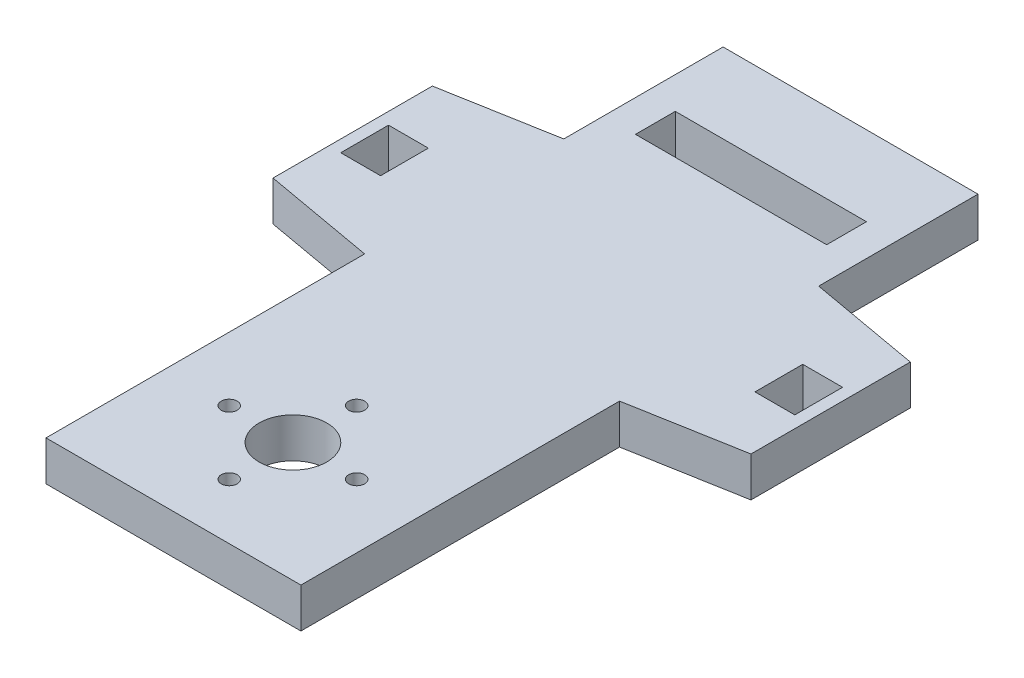
ISO-10303-21;
HEADER;
FILE_DESCRIPTION(('STEP AP214'),'2;1');
FILE_NAME('part.step','',(''),(''),'','','');
FILE_SCHEMA(('AUTOMOTIVE_DESIGN { 1 0 10303 214 1 1 1 1 }'));
ENDSEC;
DATA;
#1=APPLICATION_CONTEXT('core data for automotive mechanical design processes');
#2=APPLICATION_PROTOCOL_DEFINITION('international standard','automotive_design',2000,#1);
#3=PRODUCT_CONTEXT('',#1,'mechanical');
#4=PRODUCT('Part','Part','',(#3));
#5=PRODUCT_RELATED_PRODUCT_CATEGORY('part','',(#4));
#6=PRODUCT_DEFINITION_FORMATION('','',#4);
#7=PRODUCT_DEFINITION_CONTEXT('part definition',#1,'design');
#8=PRODUCT_DEFINITION('design','',#6,#7);
#9=PRODUCT_DEFINITION_SHAPE('','',#8);
#10=(LENGTH_UNIT() NAMED_UNIT(*) SI_UNIT(.MILLI.,.METRE.));
#11=(NAMED_UNIT(*) PLANE_ANGLE_UNIT() SI_UNIT($,.RADIAN.));
#12=(NAMED_UNIT(*) SI_UNIT($,.STERADIAN.) SOLID_ANGLE_UNIT());
#13=UNCERTAINTY_MEASURE_WITH_UNIT(LENGTH_MEASURE(1.E-05),#10,'distance_accuracy_value','');
#14=(GEOMETRIC_REPRESENTATION_CONTEXT(3) GLOBAL_UNCERTAINTY_ASSIGNED_CONTEXT((#13)) GLOBAL_UNIT_ASSIGNED_CONTEXT((#10,
#11,#12)) REPRESENTATION_CONTEXT('',''));
#15=CARTESIAN_POINT('',(0.,0.,0.));
#16=DIRECTION('',(0.,0.,1.));
#17=DIRECTION('',(1.,0.,0.));
#18=AXIS2_PLACEMENT_3D('',#15,#16,#17);
#19=CARTESIAN_POINT('',(-16.,5.,2.5));
#20=DIRECTION('',(1.,0.,0.));
#21=DIRECTION('',(0.,0.,-1.));
#22=AXIS2_PLACEMENT_3D('',#19,#20,#21);
#23=PLANE('',#22);
#24=DIRECTION('',(0.,0.,1.));
#25=VECTOR('',#24,1.);
#26=CARTESIAN_POINT('',(-16.,0.,2.5));
#27=LINE('',#26,#25);
#28=CARTESIAN_POINT('',(-16.,0.,2.5));
#29=VERTEX_POINT('',#28);
#30=CARTESIAN_POINT('',(-16.,0.,42.5));
#31=VERTEX_POINT('',#30);
#32=EDGE_CURVE('E325',#29,#31,#27,.T.);
#33=ORIENTED_EDGE('',*,*,#32,.T.);
#34=DIRECTION('',(0.,-1.,0.));
#35=VECTOR('',#34,1.);
#36=CARTESIAN_POINT('',(-16.,5.,42.5));
#37=LINE('',#36,#35);
#38=CARTESIAN_POINT('',(-16.,5.,42.5));
#39=VERTEX_POINT('',#38);
#40=EDGE_CURVE('E11',#39,#31,#37,.T.);
#41=ORIENTED_EDGE('',*,*,#40,.F.);
#42=DIRECTION('',(0.,0.,1.));
#43=VECTOR('',#42,1.);
#44=CARTESIAN_POINT('',(-16.,5.,2.5));
#45=LINE('',#44,#43);
#46=CARTESIAN_POINT('',(-16.,5.,2.5));
#47=VERTEX_POINT('',#46);
#48=EDGE_CURVE('E328',#47,#39,#45,.T.);
#49=ORIENTED_EDGE('',*,*,#48,.F.);
#50=DIRECTION('',(0.,-1.,0.));
#51=VECTOR('',#50,1.);
#52=CARTESIAN_POINT('',(-16.,5.,2.5));
#53=LINE('',#52,#51);
#54=EDGE_CURVE('E354',#47,#29,#53,.T.);
#55=ORIENTED_EDGE('',*,*,#54,.T.);
#56=EDGE_LOOP('',(#33,#41,#49,#55));
#57=FACE_BOUND('',#56,.T.);
#58=ADVANCED_FACE('F36',(#57),#23,.F.);
#59=CARTESIAN_POINT('',(-16.,5.,42.5));
#60=DIRECTION('',(0.,0.,-1.));
#61=DIRECTION('',(-1.,0.,0.));
#62=AXIS2_PLACEMENT_3D('',#59,#60,#61);
#63=PLANE('',#62);
#64=DIRECTION('',(1.,0.,0.));
#65=VECTOR('',#64,1.);
#66=CARTESIAN_POINT('',(-16.,0.,42.5));
#67=LINE('',#66,#65);
#68=CARTESIAN_POINT('',(16.,0.,42.5));
#69=VERTEX_POINT('',#68);
#70=EDGE_CURVE('E357',#31,#69,#67,.T.);
#71=ORIENTED_EDGE('',*,*,#70,.T.);
#72=DIRECTION('',(0.,-1.,0.));
#73=VECTOR('',#72,1.);
#74=CARTESIAN_POINT('',(16.,5.,42.5));
#75=LINE('',#74,#73);
#76=CARTESIAN_POINT('',(16.,5.,42.5));
#77=VERTEX_POINT('',#76);
#78=EDGE_CURVE('E43',#77,#69,#75,.T.);
#79=ORIENTED_EDGE('',*,*,#78,.F.);
#80=DIRECTION('',(1.,0.,0.));
#81=VECTOR('',#80,1.);
#82=CARTESIAN_POINT('',(-16.,5.,42.5));
#83=LINE('',#82,#81);
#84=EDGE_CURVE('E331',#39,#77,#83,.T.);
#85=ORIENTED_EDGE('',*,*,#84,.F.);
#86=ORIENTED_EDGE('',*,*,#40,.T.);
#87=EDGE_LOOP('',(#71,#79,#85,#86));
#88=FACE_BOUND('',#87,.T.);
#89=ADVANCED_FACE('F433',(#88),#63,.F.);
#90=CARTESIAN_POINT('',(16.,5.,42.5));
#91=DIRECTION('',(-1.,0.,0.));
#92=DIRECTION('',(0.,0.,1.));
#93=AXIS2_PLACEMENT_3D('',#90,#91,#92);
#94=PLANE('',#93);
#95=DIRECTION('',(0.,0.,-1.));
#96=VECTOR('',#95,1.);
#97=CARTESIAN_POINT('',(16.,0.,42.5));
#98=LINE('',#97,#96);
#99=CARTESIAN_POINT('',(16.,0.,2.5));
#100=VERTEX_POINT('',#99);
#101=EDGE_CURVE('E359',#69,#100,#98,.T.);
#102=ORIENTED_EDGE('',*,*,#101,.T.);
#103=DIRECTION('',(0.,-1.,0.));
#104=VECTOR('',#103,1.);
#105=CARTESIAN_POINT('',(16.,5.,2.5));
#106=LINE('',#105,#104);
#107=CARTESIAN_POINT('',(16.,5.,2.5));
#108=VERTEX_POINT('',#107);
#109=EDGE_CURVE('E404',#108,#100,#106,.T.);
#110=ORIENTED_EDGE('',*,*,#109,.F.);
#111=DIRECTION('',(0.,0.,-1.));
#112=VECTOR('',#111,1.);
#113=CARTESIAN_POINT('',(16.,5.,42.5));
#114=LINE('',#113,#112);
#115=EDGE_CURVE('E334',#77,#108,#114,.T.);
#116=ORIENTED_EDGE('',*,*,#115,.F.);
#117=ORIENTED_EDGE('',*,*,#78,.T.);
#118=EDGE_LOOP('',(#102,#110,#116,#117));
#119=FACE_BOUND('',#118,.T.);
#120=ADVANCED_FACE('F411',(#119),#94,.F.);
#121=CARTESIAN_POINT('',(16.,5.,2.5));
#122=DIRECTION('',(-0.175790638483658,0.,-0.984427575508482));
#123=DIRECTION('',(-0.984427575508482,0.,0.175790638483658));
#124=AXIS2_PLACEMENT_3D('',#121,#122,#123);
#125=PLANE('',#124);
#126=DIRECTION('',(0.984427575508482,0.,-0.175790638483658));
#127=VECTOR('',#126,1.);
#128=CARTESIAN_POINT('',(16.,0.,2.5));
#129=LINE('',#128,#127);
#130=CARTESIAN_POINT('',(30.,0.,0.));
#131=VERTEX_POINT('',#130);
#132=EDGE_CURVE('E361',#100,#131,#129,.T.);
#133=ORIENTED_EDGE('',*,*,#132,.T.);
#134=DIRECTION('',(0.,-1.,0.));
#135=VECTOR('',#134,1.);
#136=CARTESIAN_POINT('',(30.,5.,0.));
#137=LINE('',#136,#135);
#138=CARTESIAN_POINT('',(30.,5.,0.));
#139=VERTEX_POINT('',#138);
#140=EDGE_CURVE('E401',#139,#131,#137,.T.);
#141=ORIENTED_EDGE('',*,*,#140,.F.);
#142=DIRECTION('',(0.984427575508482,0.,-0.175790638483658));
#143=VECTOR('',#142,1.);
#144=CARTESIAN_POINT('',(16.,5.,2.5));
#145=LINE('',#144,#143);
#146=EDGE_CURVE('E336',#108,#139,#145,.T.);
#147=ORIENTED_EDGE('',*,*,#146,.F.);
#148=ORIENTED_EDGE('',*,*,#109,.T.);
#149=EDGE_LOOP('',(#133,#141,#147,#148));
#150=FACE_BOUND('',#149,.T.);
#151=ADVANCED_FACE('F421',(#150),#125,.F.);
#152=CARTESIAN_POINT('',(30.,5.,0.));
#153=DIRECTION('',(-1.,0.,0.));
#154=DIRECTION('',(0.,0.,1.));
#155=AXIS2_PLACEMENT_3D('',#152,#153,#154);
#156=PLANE('',#155);
#157=DIRECTION('',(0.,0.,-1.));
#158=VECTOR('',#157,1.);
#159=CARTESIAN_POINT('',(30.,0.,0.));
#160=LINE('',#159,#158);
#161=CARTESIAN_POINT('',(30.,0.,-20.));
#162=VERTEX_POINT('',#161);
#163=EDGE_CURVE('E363',#131,#162,#160,.T.);
#164=ORIENTED_EDGE('',*,*,#163,.T.);
#165=DIRECTION('',(0.,-1.,0.));
#166=VECTOR('',#165,1.);
#167=CARTESIAN_POINT('',(30.,5.,-20.));
#168=LINE('',#167,#166);
#169=CARTESIAN_POINT('',(30.,5.,-20.));
#170=VERTEX_POINT('',#169);
#171=EDGE_CURVE('E398',#170,#162,#168,.T.);
#172=ORIENTED_EDGE('',*,*,#171,.F.);
#173=DIRECTION('',(0.,0.,-1.));
#174=VECTOR('',#173,1.);
#175=CARTESIAN_POINT('',(30.,5.,0.));
#176=LINE('',#175,#174);
#177=EDGE_CURVE('E338',#139,#170,#176,.T.);
#178=ORIENTED_EDGE('',*,*,#177,.F.);
#179=ORIENTED_EDGE('',*,*,#140,.T.);
#180=EDGE_LOOP('',(#164,#172,#178,#179));
#181=FACE_BOUND('',#180,.T.);
#182=ADVANCED_FACE('F425',(#181),#156,.F.);
#183=CARTESIAN_POINT('',(30.,5.,-20.));
#184=DIRECTION('',(-0.175790638483657,0.,0.984427575508482));
#185=DIRECTION('',(0.984427575508482,0.,0.175790638483657));
#186=AXIS2_PLACEMENT_3D('',#183,#184,#185);
#187=PLANE('',#186);
#188=DIRECTION('',(-0.984427575508482,0.,-0.175790638483657));
#189=VECTOR('',#188,1.);
#190=CARTESIAN_POINT('',(30.,0.,-20.));
#191=LINE('',#190,#189);
#192=CARTESIAN_POINT('',(16.,0.,-22.5));
#193=VERTEX_POINT('',#192);
#194=EDGE_CURVE('E365',#162,#193,#191,.T.);
#195=ORIENTED_EDGE('',*,*,#194,.T.);
#196=DIRECTION('',(0.,-1.,0.));
#197=VECTOR('',#196,1.);
#198=CARTESIAN_POINT('',(16.,5.,-22.5));
#199=LINE('',#198,#197);
#200=CARTESIAN_POINT('',(16.,5.,-22.5));
#201=VERTEX_POINT('',#200);
#202=EDGE_CURVE('E395',#201,#193,#199,.T.);
#203=ORIENTED_EDGE('',*,*,#202,.F.);
#204=DIRECTION('',(-0.984427575508482,0.,-0.175790638483657));
#205=VECTOR('',#204,1.);
#206=CARTESIAN_POINT('',(30.,5.,-20.));
#207=LINE('',#206,#205);
#208=EDGE_CURVE('E340',#170,#201,#207,.T.);
#209=ORIENTED_EDGE('',*,*,#208,.F.);
#210=ORIENTED_EDGE('',*,*,#171,.T.);
#211=EDGE_LOOP('',(#195,#203,#209,#210));
#212=FACE_BOUND('',#211,.T.);
#213=ADVANCED_FACE('F466',(#212),#187,.F.);
#214=CARTESIAN_POINT('',(16.,5.,-22.5));
#215=DIRECTION('',(-1.,0.,0.));
#216=DIRECTION('',(0.,0.,1.));
#217=AXIS2_PLACEMENT_3D('',#214,#215,#216);
#218=PLANE('',#217);
#219=DIRECTION('',(0.,0.,-1.));
#220=VECTOR('',#219,1.);
#221=CARTESIAN_POINT('',(16.,0.,-22.5));
#222=LINE('',#221,#220);
#223=CARTESIAN_POINT('',(16.,0.,-42.5));
#224=VERTEX_POINT('',#223);
#225=EDGE_CURVE('E367',#193,#224,#222,.T.);
#226=ORIENTED_EDGE('',*,*,#225,.T.);
#227=DIRECTION('',(0.,-1.,0.));
#228=VECTOR('',#227,1.);
#229=CARTESIAN_POINT('',(16.,5.,-42.5));
#230=LINE('',#229,#228);
#231=CARTESIAN_POINT('',(16.,5.,-42.5));
#232=VERTEX_POINT('',#231);
#233=EDGE_CURVE('E392',#232,#224,#230,.T.);
#234=ORIENTED_EDGE('',*,*,#233,.F.);
#235=DIRECTION('',(0.,0.,-1.));
#236=VECTOR('',#235,1.);
#237=CARTESIAN_POINT('',(16.,5.,-22.5));
#238=LINE('',#237,#236);
#239=EDGE_CURVE('E342',#201,#232,#238,.T.);
#240=ORIENTED_EDGE('',*,*,#239,.F.);
#241=ORIENTED_EDGE('',*,*,#202,.T.);
#242=EDGE_LOOP('',(#226,#234,#240,#241));
#243=FACE_BOUND('',#242,.T.);
#244=ADVANCED_FACE('F464',(#243),#218,.F.);
#245=CARTESIAN_POINT('',(16.,5.,-42.5));
#246=DIRECTION('',(0.,0.,1.));
#247=DIRECTION('',(1.,0.,0.));
#248=AXIS2_PLACEMENT_3D('',#245,#246,#247);
#249=PLANE('',#248);
#250=DIRECTION('',(-1.,0.,0.));
#251=VECTOR('',#250,1.);
#252=CARTESIAN_POINT('',(16.,0.,-42.5));
#253=LINE('',#252,#251);
#254=CARTESIAN_POINT('',(-16.,0.,-42.5));
#255=VERTEX_POINT('',#254);
#256=EDGE_CURVE('E369',#224,#255,#253,.T.);
#257=ORIENTED_EDGE('',*,*,#256,.T.);
#258=DIRECTION('',(0.,-1.,0.));
#259=VECTOR('',#258,1.);
#260=CARTESIAN_POINT('',(-16.,5.,-42.5));
#261=LINE('',#260,#259);
#262=CARTESIAN_POINT('',(-16.,5.,-42.5));
#263=VERTEX_POINT('',#262);
#264=EDGE_CURVE('E389',#263,#255,#261,.T.);
#265=ORIENTED_EDGE('',*,*,#264,.F.);
#266=DIRECTION('',(-1.,0.,0.));
#267=VECTOR('',#266,1.);
#268=CARTESIAN_POINT('',(16.,5.,-42.5));
#269=LINE('',#268,#267);
#270=EDGE_CURVE('E344',#232,#263,#269,.T.);
#271=ORIENTED_EDGE('',*,*,#270,.F.);
#272=ORIENTED_EDGE('',*,*,#233,.T.);
#273=EDGE_LOOP('',(#257,#265,#271,#272));
#274=FACE_BOUND('',#273,.T.);
#275=ADVANCED_FACE('F460',(#274),#249,.F.);
#276=CARTESIAN_POINT('',(-16.,5.,-42.5));
#277=DIRECTION('',(1.,0.,0.));
#278=DIRECTION('',(0.,0.,-1.));
#279=AXIS2_PLACEMENT_3D('',#276,#277,#278);
#280=PLANE('',#279);
#281=DIRECTION('',(0.,0.,1.));
#282=VECTOR('',#281,1.);
#283=CARTESIAN_POINT('',(-16.,0.,-42.5));
#284=LINE('',#283,#282);
#285=CARTESIAN_POINT('',(-16.,0.,-22.5));
#286=VERTEX_POINT('',#285);
#287=EDGE_CURVE('E371',#255,#286,#284,.T.);
#288=ORIENTED_EDGE('',*,*,#287,.T.);
#289=DIRECTION('',(0.,-1.,0.));
#290=VECTOR('',#289,1.);
#291=CARTESIAN_POINT('',(-16.,5.,-22.5));
#292=LINE('',#291,#290);
#293=CARTESIAN_POINT('',(-16.,5.,-22.5));
#294=VERTEX_POINT('',#293);
#295=EDGE_CURVE('E386',#294,#286,#292,.T.);
#296=ORIENTED_EDGE('',*,*,#295,.F.);
#297=DIRECTION('',(0.,0.,1.));
#298=VECTOR('',#297,1.);
#299=CARTESIAN_POINT('',(-16.,5.,-42.5));
#300=LINE('',#299,#298);
#301=EDGE_CURVE('E346',#263,#294,#300,.T.);
#302=ORIENTED_EDGE('',*,*,#301,.F.);
#303=ORIENTED_EDGE('',*,*,#264,.T.);
#304=EDGE_LOOP('',(#288,#296,#302,#303));
#305=FACE_BOUND('',#304,.T.);
#306=ADVANCED_FACE('F455',(#305),#280,.F.);
#307=CARTESIAN_POINT('',(-16.,5.,-22.5));
#308=DIRECTION('',(0.175790638483656,0.,0.984427575508482));
#309=DIRECTION('',(0.984427575508482,0.,-0.175790638483656));
#310=AXIS2_PLACEMENT_3D('',#307,#308,#309);
#311=PLANE('',#310);
#312=DIRECTION('',(-0.984427575508482,0.,0.175790638483656));
#313=VECTOR('',#312,1.);
#314=CARTESIAN_POINT('',(-16.,0.,-22.5));
#315=LINE('',#314,#313);
#316=CARTESIAN_POINT('',(-30.,0.,-20.));
#317=VERTEX_POINT('',#316);
#318=EDGE_CURVE('E373',#286,#317,#315,.T.);
#319=ORIENTED_EDGE('',*,*,#318,.T.);
#320=DIRECTION('',(0.,-1.,0.));
#321=VECTOR('',#320,1.);
#322=CARTESIAN_POINT('',(-30.,5.,-20.));
#323=LINE('',#322,#321);
#324=CARTESIAN_POINT('',(-30.,5.,-20.));
#325=VERTEX_POINT('',#324);
#326=EDGE_CURVE('E383',#325,#317,#323,.T.);
#327=ORIENTED_EDGE('',*,*,#326,.F.);
#328=DIRECTION('',(-0.984427575508482,0.,0.175790638483656));
#329=VECTOR('',#328,1.);
#330=CARTESIAN_POINT('',(-16.,5.,-22.5));
#331=LINE('',#330,#329);
#332=EDGE_CURVE('E348',#294,#325,#331,.T.);
#333=ORIENTED_EDGE('',*,*,#332,.F.);
#334=ORIENTED_EDGE('',*,*,#295,.T.);
#335=EDGE_LOOP('',(#319,#327,#333,#334));
#336=FACE_BOUND('',#335,.T.);
#337=ADVANCED_FACE('F449',(#336),#311,.F.);
#338=CARTESIAN_POINT('',(-30.,5.,-20.));
#339=DIRECTION('',(1.,0.,0.));
#340=DIRECTION('',(0.,0.,-1.));
#341=AXIS2_PLACEMENT_3D('',#338,#339,#340);
#342=PLANE('',#341);
#343=DIRECTION('',(0.,0.,1.));
#344=VECTOR('',#343,1.);
#345=CARTESIAN_POINT('',(-30.,0.,-20.));
#346=LINE('',#345,#344);
#347=CARTESIAN_POINT('',(-30.,0.,0.));
#348=VERTEX_POINT('',#347);
#349=EDGE_CURVE('E375',#317,#348,#346,.T.);
#350=ORIENTED_EDGE('',*,*,#349,.T.);
#351=DIRECTION('',(0.,-1.,0.));
#352=VECTOR('',#351,1.);
#353=CARTESIAN_POINT('',(-30.,5.,0.));
#354=LINE('',#353,#352);
#355=CARTESIAN_POINT('',(-30.,5.,0.));
#356=VERTEX_POINT('',#355);
#357=EDGE_CURVE('E380',#356,#348,#354,.T.);
#358=ORIENTED_EDGE('',*,*,#357,.F.);
#359=DIRECTION('',(0.,0.,1.));
#360=VECTOR('',#359,1.);
#361=CARTESIAN_POINT('',(-30.,5.,-20.));
#362=LINE('',#361,#360);
#363=EDGE_CURVE('E350',#325,#356,#362,.T.);
#364=ORIENTED_EDGE('',*,*,#363,.F.);
#365=ORIENTED_EDGE('',*,*,#326,.T.);
#366=EDGE_LOOP('',(#350,#358,#364,#365));
#367=FACE_BOUND('',#366,.T.);
#368=ADVANCED_FACE('F445',(#367),#342,.F.);
#369=CARTESIAN_POINT('',(-30.,5.,0.));
#370=DIRECTION('',(0.175790638483658,0.,-0.984427575508482));
#371=DIRECTION('',(-0.984427575508482,0.,-0.175790638483658));
#372=AXIS2_PLACEMENT_3D('',#369,#370,#371);
#373=PLANE('',#372);
#374=DIRECTION('',(0.984427575508482,0.,0.175790638483658));
#375=VECTOR('',#374,1.);
#376=CARTESIAN_POINT('',(-30.,0.,0.));
#377=LINE('',#376,#375);
#378=EDGE_CURVE('E332',#348,#29,#377,.T.);
#379=ORIENTED_EDGE('',*,*,#378,.T.);
#380=ORIENTED_EDGE('',*,*,#54,.F.);
#381=DIRECTION('',(0.984427575508482,0.,0.175790638483658));
#382=VECTOR('',#381,1.);
#383=CARTESIAN_POINT('',(-30.,5.,0.));
#384=LINE('',#383,#382);
#385=EDGE_CURVE('E352',#356,#47,#384,.T.);
#386=ORIENTED_EDGE('',*,*,#385,.F.);
#387=ORIENTED_EDGE('',*,*,#357,.T.);
#388=EDGE_LOOP('',(#379,#380,#386,#387));
#389=FACE_BOUND('',#388,.T.);
#390=ADVANCED_FACE('F440',(#389),#373,.F.);
#391=CARTESIAN_POINT('',(0.,5.,0.));
#392=DIRECTION('',(0.,1.,0.));
#393=DIRECTION('',(0.,0.,1.));
#394=AXIS2_PLACEMENT_3D('',#391,#392,#393);
#395=PLANE('',#394);
#396=DIRECTION('',(0.,0.,1.));
#397=VECTOR('',#396,1.);
#398=CARTESIAN_POINT('',(-12.,5.,-32.5));
#399=LINE('',#398,#397);
#400=CARTESIAN_POINT('',(-12.,5.,-32.5));
#401=VERTEX_POINT('',#400);
#402=CARTESIAN_POINT('',(-12.,5.,-27.5));
#403=VERTEX_POINT('',#402);
#404=EDGE_CURVE('E50',#401,#403,#399,.T.);
#405=ORIENTED_EDGE('',*,*,#404,.F.);
#406=DIRECTION('',(-1.,0.,0.));
#407=VECTOR('',#406,1.);
#408=CARTESIAN_POINT('',(-12.,5.,-32.5));
#409=LINE('',#408,#407);
#410=CARTESIAN_POINT('',(12.,5.,-32.5));
#411=VERTEX_POINT('',#410);
#412=EDGE_CURVE('E278',#411,#401,#409,.T.);
#413=ORIENTED_EDGE('',*,*,#412,.F.);
#414=DIRECTION('',(0.,0.,-1.));
#415=VECTOR('',#414,1.);
#416=CARTESIAN_POINT('',(12.,5.,-32.5));
#417=LINE('',#416,#415);
#418=CARTESIAN_POINT('',(12.,5.,-27.5));
#419=VERTEX_POINT('',#418);
#420=EDGE_CURVE('E293',#419,#411,#417,.T.);
#421=ORIENTED_EDGE('',*,*,#420,.F.);
#422=DIRECTION('',(1.,0.,0.));
#423=VECTOR('',#422,1.);
#424=CARTESIAN_POINT('',(-12.,5.,-27.5));
#425=LINE('',#424,#423);
#426=EDGE_CURVE('E289',#403,#419,#425,.T.);
#427=ORIENTED_EDGE('',*,*,#426,.F.);
#428=EDGE_LOOP('',(#405,#413,#421,#427));
#429=FACE_BOUND('',#428,.T.);
#430=CARTESIAN_POINT('',(0.,5.,19.5));
#431=DIRECTION('',(0.,1.,0.));
#432=DIRECTION('',(0.,0.,1.));
#433=AXIS2_PLACEMENT_3D('',#430,#431,#432);
#434=CIRCLE('',#433,1.);
#435=CARTESIAN_POINT('',(0.,5.,20.5));
#436=VERTEX_POINT('',#435);
#437=EDGE_CURVE('E308',#436,#436,#434,.T.);
#438=ORIENTED_EDGE('',*,*,#437,.F.);
#439=EDGE_LOOP('',(#438));
#440=FACE_BOUND('',#439,.T.);
#441=CARTESIAN_POINT('',(8.,5.,27.5));
#442=DIRECTION('',(0.,1.,0.));
#443=DIRECTION('',(0.,0.,1.));
#444=AXIS2_PLACEMENT_3D('',#441,#442,#443);
#445=CIRCLE('',#444,1.);
#446=CARTESIAN_POINT('',(8.,5.,28.5));
#447=VERTEX_POINT('',#446);
#448=EDGE_CURVE('E314',#447,#447,#445,.T.);
#449=ORIENTED_EDGE('',*,*,#448,.F.);
#450=EDGE_LOOP('',(#449));
#451=FACE_BOUND('',#450,.T.);
#452=CARTESIAN_POINT('',(0.,5.,35.5));
#453=DIRECTION('',(0.,1.,0.));
#454=DIRECTION('',(0.,0.,1.));
#455=AXIS2_PLACEMENT_3D('',#452,#453,#454);
#456=CIRCLE('',#455,1.);
#457=CARTESIAN_POINT('',(0.,5.,36.5));
#458=VERTEX_POINT('',#457);
#459=EDGE_CURVE('E233',#458,#458,#456,.T.);
#460=ORIENTED_EDGE('',*,*,#459,.F.);
#461=EDGE_LOOP('',(#460));
#462=FACE_BOUND('',#461,.T.);
#463=DIRECTION('',(-1.,0.,0.));
#464=VECTOR('',#463,1.);
#465=CARTESIAN_POINT('',(-28.5,5.,-13.));
#466=LINE('',#465,#464);
#467=CARTESIAN_POINT('',(-23.5,5.,-13.));
#468=VERTEX_POINT('',#467);
#469=CARTESIAN_POINT('',(-28.5,5.,-13.));
#470=VERTEX_POINT('',#469);
#471=EDGE_CURVE('E58',#468,#470,#466,.T.);
#472=ORIENTED_EDGE('',*,*,#471,.F.);
#473=DIRECTION('',(0.,0.,-1.));
#474=VECTOR('',#473,1.);
#475=CARTESIAN_POINT('',(-23.5,5.,-7.));
#476=LINE('',#475,#474);
#477=CARTESIAN_POINT('',(-23.5,5.,-7.));
#478=VERTEX_POINT('',#477);
#479=EDGE_CURVE('E217',#478,#468,#476,.T.);
#480=ORIENTED_EDGE('',*,*,#479,.F.);
#481=DIRECTION('',(1.,0.,0.));
#482=VECTOR('',#481,1.);
#483=CARTESIAN_POINT('',(-28.5,5.,-7.));
#484=LINE('',#483,#482);
#485=CARTESIAN_POINT('',(-28.5,5.,-7.));
#486=VERTEX_POINT('',#485);
#487=EDGE_CURVE('E220',#486,#478,#484,.T.);
#488=ORIENTED_EDGE('',*,*,#487,.F.);
#489=DIRECTION('',(0.,0.,1.));
#490=VECTOR('',#489,1.);
#491=CARTESIAN_POINT('',(-28.5,5.,-13.));
#492=LINE('',#491,#490);
#493=EDGE_CURVE('E226',#470,#486,#492,.T.);
#494=ORIENTED_EDGE('',*,*,#493,.F.);
#495=EDGE_LOOP('',(#472,#480,#488,#494));
#496=FACE_BOUND('',#495,.T.);
#497=DIRECTION('',(0.,0.,1.));
#498=VECTOR('',#497,1.);
#499=CARTESIAN_POINT('',(23.5,5.,-7.));
#500=LINE('',#499,#498);
#501=CARTESIAN_POINT('',(23.5,5.,-13.));
#502=VERTEX_POINT('',#501);
#503=CARTESIAN_POINT('',(23.5,5.,-7.));
#504=VERTEX_POINT('',#503);
#505=EDGE_CURVE('E251',#502,#504,#500,.T.);
#506=ORIENTED_EDGE('',*,*,#505,.F.);
#507=DIRECTION('',(-1.,0.,0.));
#508=VECTOR('',#507,1.);
#509=CARTESIAN_POINT('',(23.5,5.,-13.));
#510=LINE('',#509,#508);
#511=CARTESIAN_POINT('',(28.5,5.,-13.));
#512=VERTEX_POINT('',#511);
#513=EDGE_CURVE('E241',#512,#502,#510,.T.);
#514=ORIENTED_EDGE('',*,*,#513,.F.);
#515=DIRECTION('',(0.,0.,-1.));
#516=VECTOR('',#515,1.);
#517=CARTESIAN_POINT('',(28.5,5.,-13.));
#518=LINE('',#517,#516);
#519=CARTESIAN_POINT('',(28.5,5.,-7.));
#520=VERTEX_POINT('',#519);
#521=EDGE_CURVE('E257',#520,#512,#518,.T.);
#522=ORIENTED_EDGE('',*,*,#521,.F.);
#523=DIRECTION('',(1.,0.,0.));
#524=VECTOR('',#523,1.);
#525=CARTESIAN_POINT('',(28.5,5.,-7.));
#526=LINE('',#525,#524);
#527=EDGE_CURVE('E253',#504,#520,#526,.T.);
#528=ORIENTED_EDGE('',*,*,#527,.F.);
#529=EDGE_LOOP('',(#506,#514,#522,#528));
#530=FACE_BOUND('',#529,.T.);
#531=CARTESIAN_POINT('',(0.,5.,27.5));
#532=DIRECTION('',(0.,1.,0.));
#533=DIRECTION('',(0.,0.,1.));
#534=AXIS2_PLACEMENT_3D('',#531,#532,#533);
#535=CIRCLE('',#534,4.25);
#536=CARTESIAN_POINT('',(0.,5.,31.75));
#537=VERTEX_POINT('',#536);
#538=EDGE_CURVE('E271',#537,#537,#535,.T.);
#539=ORIENTED_EDGE('',*,*,#538,.F.);
#540=EDGE_LOOP('',(#539));
#541=FACE_BOUND('',#540,.T.);
#542=CARTESIAN_POINT('',(-8.,5.,27.5));
#543=DIRECTION('',(0.,1.,0.));
#544=DIRECTION('',(0.,0.,1.));
#545=AXIS2_PLACEMENT_3D('',#542,#543,#544);
#546=CIRCLE('',#545,1.);
#547=CARTESIAN_POINT('',(-8.,5.,28.5));
#548=VERTEX_POINT('',#547);
#549=EDGE_CURVE('E300',#548,#548,#546,.T.);
#550=ORIENTED_EDGE('',*,*,#549,.F.);
#551=EDGE_LOOP('',(#550));
#552=FACE_BOUND('',#551,.T.);
#553=ORIENTED_EDGE('',*,*,#48,.T.);
#554=ORIENTED_EDGE('',*,*,#84,.T.);
#555=ORIENTED_EDGE('',*,*,#115,.T.);
#556=ORIENTED_EDGE('',*,*,#146,.T.);
#557=ORIENTED_EDGE('',*,*,#177,.T.);
#558=ORIENTED_EDGE('',*,*,#208,.T.);
#559=ORIENTED_EDGE('',*,*,#239,.T.);
#560=ORIENTED_EDGE('',*,*,#270,.T.);
#561=ORIENTED_EDGE('',*,*,#301,.T.);
#562=ORIENTED_EDGE('',*,*,#332,.T.);
#563=ORIENTED_EDGE('',*,*,#363,.T.);
#564=ORIENTED_EDGE('',*,*,#385,.T.);
#565=EDGE_LOOP('',(#553,#554,#555,#556,#557,#558,#559,#560,#561,#562,#563,#564));
#566=FACE_BOUND('',#565,.T.);
#567=ADVANCED_FACE('F429',(#429,#440,#451,#462,#496,#530,#541,#552,#566),#395,.T.);
#568=CARTESIAN_POINT('',(0.,0.,0.));
#569=DIRECTION('',(0.,1.,0.));
#570=DIRECTION('',(0.,0.,1.));
#571=AXIS2_PLACEMENT_3D('',#568,#569,#570);
#572=PLANE('',#571);
#573=DIRECTION('',(-1.,0.,0.));
#574=VECTOR('',#573,1.);
#575=CARTESIAN_POINT('',(-12.,0.,-32.5));
#576=LINE('',#575,#574);
#577=CARTESIAN_POINT('',(12.,0.,-32.5));
#578=VERTEX_POINT('',#577);
#579=CARTESIAN_POINT('',(-12.,0.,-32.5));
#580=VERTEX_POINT('',#579);
#581=EDGE_CURVE('E284',#578,#580,#576,.T.);
#582=ORIENTED_EDGE('',*,*,#581,.T.);
#583=DIRECTION('',(0.,0.,1.));
#584=VECTOR('',#583,1.);
#585=CARTESIAN_POINT('',(-12.,0.,-32.5));
#586=LINE('',#585,#584);
#587=CARTESIAN_POINT('',(-12.,0.,-27.5));
#588=VERTEX_POINT('',#587);
#589=EDGE_CURVE('E274',#580,#588,#586,.T.);
#590=ORIENTED_EDGE('',*,*,#589,.T.);
#591=DIRECTION('',(1.,0.,0.));
#592=VECTOR('',#591,1.);
#593=CARTESIAN_POINT('',(-12.,0.,-27.5));
#594=LINE('',#593,#592);
#595=CARTESIAN_POINT('',(12.,0.,-27.5));
#596=VERTEX_POINT('',#595);
#597=EDGE_CURVE('E277',#588,#596,#594,.T.);
#598=ORIENTED_EDGE('',*,*,#597,.T.);
#599=DIRECTION('',(0.,0.,-1.));
#600=VECTOR('',#599,1.);
#601=CARTESIAN_POINT('',(12.,0.,-32.5));
#602=LINE('',#601,#600);
#603=EDGE_CURVE('E281',#596,#578,#602,.T.);
#604=ORIENTED_EDGE('',*,*,#603,.T.);
#605=EDGE_LOOP('',(#582,#590,#598,#604));
#606=FACE_BOUND('',#605,.T.);
#607=CARTESIAN_POINT('',(0.,0.,19.5));
#608=DIRECTION('',(0.,1.,0.));
#609=DIRECTION('',(0.,0.,1.));
#610=AXIS2_PLACEMENT_3D('',#607,#608,#609);
#611=CIRCLE('',#610,1.);
#612=CARTESIAN_POINT('',(0.,0.,20.5));
#613=VERTEX_POINT('',#612);
#614=EDGE_CURVE('E290',#613,#613,#611,.T.);
#615=ORIENTED_EDGE('',*,*,#614,.T.);
#616=EDGE_LOOP('',(#615));
#617=FACE_BOUND('',#616,.T.);
#618=CARTESIAN_POINT('',(8.,0.,27.5));
#619=DIRECTION('',(0.,1.,0.));
#620=DIRECTION('',(0.,0.,1.));
#621=AXIS2_PLACEMENT_3D('',#618,#619,#620);
#622=CIRCLE('',#621,1.);
#623=CARTESIAN_POINT('',(8.,0.,28.5));
#624=VERTEX_POINT('',#623);
#625=EDGE_CURVE('E311',#624,#624,#622,.T.);
#626=ORIENTED_EDGE('',*,*,#625,.T.);
#627=EDGE_LOOP('',(#626));
#628=FACE_BOUND('',#627,.T.);
#629=CARTESIAN_POINT('',(0.,0.,35.5));
#630=DIRECTION('',(0.,1.,0.));
#631=DIRECTION('',(0.,0.,1.));
#632=AXIS2_PLACEMENT_3D('',#629,#630,#631);
#633=CIRCLE('',#632,1.);
#634=CARTESIAN_POINT('',(0.,0.,36.5));
#635=VERTEX_POINT('',#634);
#636=EDGE_CURVE('E317',#635,#635,#633,.T.);
#637=ORIENTED_EDGE('',*,*,#636,.T.);
#638=EDGE_LOOP('',(#637));
#639=FACE_BOUND('',#638,.T.);
#640=DIRECTION('',(0.,0.,-1.));
#641=VECTOR('',#640,1.);
#642=CARTESIAN_POINT('',(-23.5,0.,-7.));
#643=LINE('',#642,#641);
#644=CARTESIAN_POINT('',(-23.5,0.,-7.));
#645=VERTEX_POINT('',#644);
#646=CARTESIAN_POINT('',(-23.5,0.,-13.));
#647=VERTEX_POINT('',#646);
#648=EDGE_CURVE('E204',#645,#647,#643,.T.);
#649=ORIENTED_EDGE('',*,*,#648,.T.);
#650=DIRECTION('',(-1.,0.,0.));
#651=VECTOR('',#650,1.);
#652=CARTESIAN_POINT('',(-28.5,0.,-13.));
#653=LINE('',#652,#651);
#654=CARTESIAN_POINT('',(-28.5,0.,-13.));
#655=VERTEX_POINT('',#654);
#656=EDGE_CURVE('E198',#647,#655,#653,.T.);
#657=ORIENTED_EDGE('',*,*,#656,.T.);
#658=DIRECTION('',(0.,0.,1.));
#659=VECTOR('',#658,1.);
#660=CARTESIAN_POINT('',(-28.5,0.,-13.));
#661=LINE('',#660,#659);
#662=CARTESIAN_POINT('',(-28.5,0.,-7.));
#663=VERTEX_POINT('',#662);
#664=EDGE_CURVE('E208',#655,#663,#661,.T.);
#665=ORIENTED_EDGE('',*,*,#664,.T.);
#666=DIRECTION('',(1.,0.,0.));
#667=VECTOR('',#666,1.);
#668=CARTESIAN_POINT('',(-28.5,0.,-7.));
#669=LINE('',#668,#667);
#670=EDGE_CURVE('E212',#663,#645,#669,.T.);
#671=ORIENTED_EDGE('',*,*,#670,.T.);
#672=EDGE_LOOP('',(#649,#657,#665,#671));
#673=FACE_BOUND('',#672,.T.);
#674=DIRECTION('',(-1.,0.,0.));
#675=VECTOR('',#674,1.);
#676=CARTESIAN_POINT('',(23.5,0.,-13.));
#677=LINE('',#676,#675);
#678=CARTESIAN_POINT('',(28.5,0.,-13.));
#679=VERTEX_POINT('',#678);
#680=CARTESIAN_POINT('',(23.5,0.,-13.));
#681=VERTEX_POINT('',#680);
#682=EDGE_CURVE('E247',#679,#681,#677,.T.);
#683=ORIENTED_EDGE('',*,*,#682,.T.);
#684=DIRECTION('',(0.,0.,1.));
#685=VECTOR('',#684,1.);
#686=CARTESIAN_POINT('',(23.5,0.,-7.));
#687=LINE('',#686,#685);
#688=CARTESIAN_POINT('',(23.5,0.,-7.));
#689=VERTEX_POINT('',#688);
#690=EDGE_CURVE('E237',#681,#689,#687,.T.);
#691=ORIENTED_EDGE('',*,*,#690,.T.);
#692=DIRECTION('',(1.,0.,0.));
#693=VECTOR('',#692,1.);
#694=CARTESIAN_POINT('',(28.5,0.,-7.));
#695=LINE('',#694,#693);
#696=CARTESIAN_POINT('',(28.5,0.,-7.));
#697=VERTEX_POINT('',#696);
#698=EDGE_CURVE('E240',#689,#697,#695,.T.);
#699=ORIENTED_EDGE('',*,*,#698,.T.);
#700=DIRECTION('',(0.,0.,-1.));
#701=VECTOR('',#700,1.);
#702=CARTESIAN_POINT('',(28.5,0.,-13.));
#703=LINE('',#702,#701);
#704=EDGE_CURVE('E244',#697,#679,#703,.T.);
#705=ORIENTED_EDGE('',*,*,#704,.T.);
#706=EDGE_LOOP('',(#683,#691,#699,#705));
#707=FACE_BOUND('',#706,.T.);
#708=CARTESIAN_POINT('',(0.,0.,27.5));
#709=DIRECTION('',(0.,1.,0.));
#710=DIRECTION('',(0.,0.,1.));
#711=AXIS2_PLACEMENT_3D('',#708,#709,#710);
#712=CIRCLE('',#711,4.25);
#713=CARTESIAN_POINT('',(0.,0.,31.75));
#714=VERTEX_POINT('',#713);
#715=EDGE_CURVE('E254',#714,#714,#712,.T.);
#716=ORIENTED_EDGE('',*,*,#715,.T.);
#717=EDGE_LOOP('',(#716));
#718=FACE_BOUND('',#717,.T.);
#719=CARTESIAN_POINT('',(-8.,0.,27.5));
#720=DIRECTION('',(0.,1.,0.));
#721=DIRECTION('',(0.,0.,1.));
#722=AXIS2_PLACEMENT_3D('',#719,#720,#721);
#723=CIRCLE('',#722,1.);
#724=CARTESIAN_POINT('',(-8.,0.,28.5));
#725=VERTEX_POINT('',#724);
#726=EDGE_CURVE('E322',#725,#725,#723,.T.);
#727=ORIENTED_EDGE('',*,*,#726,.T.);
#728=EDGE_LOOP('',(#727));
#729=FACE_BOUND('',#728,.T.);
#730=ORIENTED_EDGE('',*,*,#32,.F.);
#731=ORIENTED_EDGE('',*,*,#378,.F.);
#732=ORIENTED_EDGE('',*,*,#349,.F.);
#733=ORIENTED_EDGE('',*,*,#318,.F.);
#734=ORIENTED_EDGE('',*,*,#287,.F.);
#735=ORIENTED_EDGE('',*,*,#256,.F.);
#736=ORIENTED_EDGE('',*,*,#225,.F.);
#737=ORIENTED_EDGE('',*,*,#194,.F.);
#738=ORIENTED_EDGE('',*,*,#163,.F.);
#739=ORIENTED_EDGE('',*,*,#132,.F.);
#740=ORIENTED_EDGE('',*,*,#101,.F.);
#741=ORIENTED_EDGE('',*,*,#70,.F.);
#742=EDGE_LOOP('',(#730,#731,#732,#733,#734,#735,#736,#737,#738,#739,#740,#741));
#743=FACE_BOUND('',#742,.T.);
#744=ADVANCED_FACE('F214',(#606,#617,#628,#639,#673,#707,#718,#729,#743),#572,.F.);
#745=CARTESIAN_POINT('',(-8.,0.,27.5));
#746=DIRECTION('',(0.,1.,0.));
#747=DIRECTION('',(0.,0.,1.));
#748=AXIS2_PLACEMENT_3D('',#745,#746,#747);
#749=CYLINDRICAL_SURFACE('',#748,1.);
#750=ORIENTED_EDGE('',*,*,#726,.F.);
#751=EDGE_LOOP('',(#750));
#752=FACE_BOUND('',#751,.T.);
#753=ORIENTED_EDGE('',*,*,#549,.T.);
#754=EDGE_LOOP('',(#753));
#755=FACE_BOUND('',#754,.T.);
#756=ADVANCED_FACE('F558',(#752,#755),#749,.F.);
#757=CARTESIAN_POINT('',(0.,0.,27.5));
#758=DIRECTION('',(0.,1.,0.));
#759=DIRECTION('',(0.,0.,1.));
#760=AXIS2_PLACEMENT_3D('',#757,#758,#759);
#761=CYLINDRICAL_SURFACE('',#760,4.25);
#762=ORIENTED_EDGE('',*,*,#715,.F.);
#763=EDGE_LOOP('',(#762));
#764=FACE_BOUND('',#763,.T.);
#765=ORIENTED_EDGE('',*,*,#538,.T.);
#766=EDGE_LOOP('',(#765));
#767=FACE_BOUND('',#766,.T.);
#768=ADVANCED_FACE('F567',(#764,#767),#761,.F.);
#769=CARTESIAN_POINT('',(23.5,0.,-7.));
#770=DIRECTION('',(-1.,0.,0.));
#771=DIRECTION('',(0.,0.,1.));
#772=AXIS2_PLACEMENT_3D('',#769,#770,#771);
#773=PLANE('',#772);
#774=ORIENTED_EDGE('',*,*,#505,.T.);
#775=DIRECTION('',(0.,1.,0.));
#776=VECTOR('',#775,1.);
#777=CARTESIAN_POINT('',(23.5,0.,-7.));
#778=LINE('',#777,#776);
#779=EDGE_CURVE('E250',#689,#504,#778,.T.);
#780=ORIENTED_EDGE('',*,*,#779,.F.);
#781=ORIENTED_EDGE('',*,*,#690,.F.);
#782=DIRECTION('',(0.,1.,0.));
#783=VECTOR('',#782,1.);
#784=CARTESIAN_POINT('',(23.5,0.,-13.));
#785=LINE('',#784,#783);
#786=EDGE_CURVE('E227',#681,#502,#785,.T.);
#787=ORIENTED_EDGE('',*,*,#786,.T.);
#788=EDGE_LOOP('',(#774,#780,#781,#787));
#789=FACE_BOUND('',#788,.T.);
#790=ADVANCED_FACE('F577',(#789),#773,.F.);
#791=CARTESIAN_POINT('',(23.5,0.,-13.));
#792=DIRECTION('',(0.,0.,-1.));
#793=DIRECTION('',(-1.,0.,0.));
#794=AXIS2_PLACEMENT_3D('',#791,#792,#793);
#795=PLANE('',#794);
#796=ORIENTED_EDGE('',*,*,#513,.T.);
#797=ORIENTED_EDGE('',*,*,#786,.F.);
#798=ORIENTED_EDGE('',*,*,#682,.F.);
#799=DIRECTION('',(0.,1.,0.));
#800=VECTOR('',#799,1.);
#801=CARTESIAN_POINT('',(28.5,0.,-13.));
#802=LINE('',#801,#800);
#803=EDGE_CURVE('E263',#679,#512,#802,.T.);
#804=ORIENTED_EDGE('',*,*,#803,.T.);
#805=EDGE_LOOP('',(#796,#797,#798,#804));
#806=FACE_BOUND('',#805,.T.);
#807=ADVANCED_FACE('F587',(#806),#795,.F.);
#808=CARTESIAN_POINT('',(28.5,0.,-13.));
#809=DIRECTION('',(1.,0.,0.));
#810=DIRECTION('',(0.,0.,-1.));
#811=AXIS2_PLACEMENT_3D('',#808,#809,#810);
#812=PLANE('',#811);
#813=ORIENTED_EDGE('',*,*,#521,.T.);
#814=ORIENTED_EDGE('',*,*,#803,.F.);
#815=ORIENTED_EDGE('',*,*,#704,.F.);
#816=DIRECTION('',(0.,1.,0.));
#817=VECTOR('',#816,1.);
#818=CARTESIAN_POINT('',(28.5,0.,-7.));
#819=LINE('',#818,#817);
#820=EDGE_CURVE('E265',#697,#520,#819,.T.);
#821=ORIENTED_EDGE('',*,*,#820,.T.);
#822=EDGE_LOOP('',(#813,#814,#815,#821));
#823=FACE_BOUND('',#822,.T.);
#824=ADVANCED_FACE('F597',(#823),#812,.F.);
#825=CARTESIAN_POINT('',(28.5,0.,-7.));
#826=DIRECTION('',(0.,0.,1.));
#827=DIRECTION('',(1.,0.,0.));
#828=AXIS2_PLACEMENT_3D('',#825,#826,#827);
#829=PLANE('',#828);
#830=ORIENTED_EDGE('',*,*,#527,.T.);
#831=ORIENTED_EDGE('',*,*,#820,.F.);
#832=ORIENTED_EDGE('',*,*,#698,.F.);
#833=ORIENTED_EDGE('',*,*,#779,.T.);
#834=EDGE_LOOP('',(#830,#831,#832,#833));
#835=FACE_BOUND('',#834,.T.);
#836=ADVANCED_FACE('F607',(#835),#829,.F.);
#837=CARTESIAN_POINT('',(-28.5,0.,-13.));
#838=DIRECTION('',(0.,0.,-1.));
#839=DIRECTION('',(-1.,0.,0.));
#840=AXIS2_PLACEMENT_3D('',#837,#838,#839);
#841=PLANE('',#840);
#842=ORIENTED_EDGE('',*,*,#471,.T.);
#843=DIRECTION('',(0.,1.,0.));
#844=VECTOR('',#843,1.);
#845=CARTESIAN_POINT('',(-28.5,0.,-13.));
#846=LINE('',#845,#844);
#847=EDGE_CURVE('E194',#655,#470,#846,.T.);
#848=ORIENTED_EDGE('',*,*,#847,.F.);
#849=ORIENTED_EDGE('',*,*,#656,.F.);
#850=DIRECTION('',(0.,1.,0.));
#851=VECTOR('',#850,1.);
#852=CARTESIAN_POINT('',(-23.5,0.,-13.));
#853=LINE('',#852,#851);
#854=EDGE_CURVE('E231',#647,#468,#853,.T.);
#855=ORIENTED_EDGE('',*,*,#854,.T.);
#856=EDGE_LOOP('',(#842,#848,#849,#855));
#857=FACE_BOUND('',#856,.T.);
#858=ADVANCED_FACE('F196',(#857),#841,.F.);
#859=CARTESIAN_POINT('',(-23.5,0.,-7.));
#860=DIRECTION('',(1.,0.,0.));
#861=DIRECTION('',(0.,0.,-1.));
#862=AXIS2_PLACEMENT_3D('',#859,#860,#861);
#863=PLANE('',#862);
#864=ORIENTED_EDGE('',*,*,#479,.T.);
#865=ORIENTED_EDGE('',*,*,#854,.F.);
#866=ORIENTED_EDGE('',*,*,#648,.F.);
#867=DIRECTION('',(0.,1.,0.));
#868=VECTOR('',#867,1.);
#869=CARTESIAN_POINT('',(-23.5,0.,-7.));
#870=LINE('',#869,#868);
#871=EDGE_CURVE('E234',#645,#478,#870,.T.);
#872=ORIENTED_EDGE('',*,*,#871,.T.);
#873=EDGE_LOOP('',(#864,#865,#866,#872));
#874=FACE_BOUND('',#873,.T.);
#875=ADVANCED_FACE('F626',(#874),#863,.F.);
#876=CARTESIAN_POINT('',(-28.5,0.,-7.));
#877=DIRECTION('',(0.,0.,1.));
#878=DIRECTION('',(1.,0.,0.));
#879=AXIS2_PLACEMENT_3D('',#876,#877,#878);
#880=PLANE('',#879);
#881=ORIENTED_EDGE('',*,*,#487,.T.);
#882=ORIENTED_EDGE('',*,*,#871,.F.);
#883=ORIENTED_EDGE('',*,*,#670,.F.);
#884=DIRECTION('',(0.,1.,0.));
#885=VECTOR('',#884,1.);
#886=CARTESIAN_POINT('',(-28.5,0.,-7.));
#887=LINE('',#886,#885);
#888=EDGE_CURVE('E203',#663,#486,#887,.T.);
#889=ORIENTED_EDGE('',*,*,#888,.T.);
#890=EDGE_LOOP('',(#881,#882,#883,#889));
#891=FACE_BOUND('',#890,.T.);
#892=ADVANCED_FACE('F635',(#891),#880,.F.);
#893=CARTESIAN_POINT('',(-28.5,0.,-13.));
#894=DIRECTION('',(-1.,0.,0.));
#895=DIRECTION('',(0.,0.,1.));
#896=AXIS2_PLACEMENT_3D('',#893,#894,#895);
#897=PLANE('',#896);
#898=ORIENTED_EDGE('',*,*,#493,.T.);
#899=ORIENTED_EDGE('',*,*,#888,.F.);
#900=ORIENTED_EDGE('',*,*,#664,.F.);
#901=ORIENTED_EDGE('',*,*,#847,.T.);
#902=EDGE_LOOP('',(#898,#899,#900,#901));
#903=FACE_BOUND('',#902,.T.);
#904=ADVANCED_FACE('F209',(#903),#897,.F.);
#905=CARTESIAN_POINT('',(0.,0.,35.5));
#906=DIRECTION('',(0.,1.,0.));
#907=DIRECTION('',(0.,0.,1.));
#908=AXIS2_PLACEMENT_3D('',#905,#906,#907);
#909=CYLINDRICAL_SURFACE('',#908,1.);
#910=ORIENTED_EDGE('',*,*,#636,.F.);
#911=EDGE_LOOP('',(#910));
#912=FACE_BOUND('',#911,.T.);
#913=ORIENTED_EDGE('',*,*,#459,.T.);
#914=EDGE_LOOP('',(#913));
#915=FACE_BOUND('',#914,.T.);
#916=ADVANCED_FACE('F654',(#912,#915),#909,.F.);
#917=CARTESIAN_POINT('',(8.,0.,27.5));
#918=DIRECTION('',(0.,1.,0.));
#919=DIRECTION('',(0.,0.,1.));
#920=AXIS2_PLACEMENT_3D('',#917,#918,#919);
#921=CYLINDRICAL_SURFACE('',#920,1.);
#922=ORIENTED_EDGE('',*,*,#625,.F.);
#923=EDGE_LOOP('',(#922));
#924=FACE_BOUND('',#923,.T.);
#925=ORIENTED_EDGE('',*,*,#448,.T.);
#926=EDGE_LOOP('',(#925));
#927=FACE_BOUND('',#926,.T.);
#928=ADVANCED_FACE('F663',(#924,#927),#921,.F.);
#929=CARTESIAN_POINT('',(0.,0.,19.5));
#930=DIRECTION('',(0.,1.,0.));
#931=DIRECTION('',(0.,0.,1.));
#932=AXIS2_PLACEMENT_3D('',#929,#930,#931);
#933=CYLINDRICAL_SURFACE('',#932,1.);
#934=ORIENTED_EDGE('',*,*,#614,.F.);
#935=EDGE_LOOP('',(#934));
#936=FACE_BOUND('',#935,.T.);
#937=ORIENTED_EDGE('',*,*,#437,.T.);
#938=EDGE_LOOP('',(#937));
#939=FACE_BOUND('',#938,.T.);
#940=ADVANCED_FACE('F673',(#936,#939),#933,.F.);
#941=CARTESIAN_POINT('',(-12.,0.,-32.5));
#942=DIRECTION('',(-1.,0.,0.));
#943=DIRECTION('',(0.,0.,1.));
#944=AXIS2_PLACEMENT_3D('',#941,#942,#943);
#945=PLANE('',#944);
#946=ORIENTED_EDGE('',*,*,#404,.T.);
#947=DIRECTION('',(0.,1.,0.));
#948=VECTOR('',#947,1.);
#949=CARTESIAN_POINT('',(-12.,0.,-27.5));
#950=LINE('',#949,#948);
#951=EDGE_CURVE('E287',#588,#403,#950,.T.);
#952=ORIENTED_EDGE('',*,*,#951,.F.);
#953=ORIENTED_EDGE('',*,*,#589,.F.);
#954=DIRECTION('',(0.,1.,0.));
#955=VECTOR('',#954,1.);
#956=CARTESIAN_POINT('',(-12.,0.,-32.5));
#957=LINE('',#956,#955);
#958=EDGE_CURVE('E298',#580,#401,#957,.T.);
#959=ORIENTED_EDGE('',*,*,#958,.T.);
#960=EDGE_LOOP('',(#946,#952,#953,#959));
#961=FACE_BOUND('',#960,.T.);
#962=ADVANCED_FACE('F683',(#961),#945,.F.);
#963=CARTESIAN_POINT('',(-12.,0.,-32.5));
#964=DIRECTION('',(0.,0.,-1.));
#965=DIRECTION('',(-1.,0.,0.));
#966=AXIS2_PLACEMENT_3D('',#963,#964,#965);
#967=PLANE('',#966);
#968=ORIENTED_EDGE('',*,*,#412,.T.);
#969=ORIENTED_EDGE('',*,*,#958,.F.);
#970=ORIENTED_EDGE('',*,*,#581,.F.);
#971=DIRECTION('',(0.,1.,0.));
#972=VECTOR('',#971,1.);
#973=CARTESIAN_POINT('',(12.,0.,-32.5));
#974=LINE('',#973,#972);
#975=EDGE_CURVE('E301',#578,#411,#974,.T.);
#976=ORIENTED_EDGE('',*,*,#975,.T.);
#977=EDGE_LOOP('',(#968,#969,#970,#976));
#978=FACE_BOUND('',#977,.T.);
#979=ADVANCED_FACE('F693',(#978),#967,.F.);
#980=CARTESIAN_POINT('',(12.,0.,-32.5));
#981=DIRECTION('',(1.,0.,0.));
#982=DIRECTION('',(0.,0.,-1.));
#983=AXIS2_PLACEMENT_3D('',#980,#981,#982);
#984=PLANE('',#983);
#985=ORIENTED_EDGE('',*,*,#420,.T.);
#986=ORIENTED_EDGE('',*,*,#975,.F.);
#987=ORIENTED_EDGE('',*,*,#603,.F.);
#988=DIRECTION('',(0.,1.,0.));
#989=VECTOR('',#988,1.);
#990=CARTESIAN_POINT('',(12.,0.,-27.5));
#991=LINE('',#990,#989);
#992=EDGE_CURVE('E303',#596,#419,#991,.T.);
#993=ORIENTED_EDGE('',*,*,#992,.T.);
#994=EDGE_LOOP('',(#985,#986,#987,#993));
#995=FACE_BOUND('',#994,.T.);
#996=ADVANCED_FACE('F702',(#995),#984,.F.);
#997=CARTESIAN_POINT('',(-12.,0.,-27.5));
#998=DIRECTION('',(0.,0.,1.));
#999=DIRECTION('',(1.,0.,0.));
#1000=AXIS2_PLACEMENT_3D('',#997,#998,#999);
#1001=PLANE('',#1000);
#1002=ORIENTED_EDGE('',*,*,#426,.T.);
#1003=ORIENTED_EDGE('',*,*,#992,.F.);
#1004=ORIENTED_EDGE('',*,*,#597,.F.);
#1005=ORIENTED_EDGE('',*,*,#951,.T.);
#1006=EDGE_LOOP('',(#1002,#1003,#1004,#1005));
#1007=FACE_BOUND('',#1006,.T.);
#1008=ADVANCED_FACE('F712',(#1007),#1001,.F.);
#1009=CLOSED_SHELL('',(#58,#89,#120,#151,#182,#213,#244,#275,#306,#337,#368,#390,#567,#744,#756,
#768,#790,#807,#824,#836,#858,#875,#892,#904,#916,#928,#940,#962,#979,#996,#1008));
#1010=MANIFOLD_SOLID_BREP('B2',#1009);
#1011=ADVANCED_BREP_SHAPE_REPRESENTATION('',(#18,#1010),#14);
#1012=SHAPE_DEFINITION_REPRESENTATION(#9,#1011);
ENDSEC;
END-ISO-10303-21;
